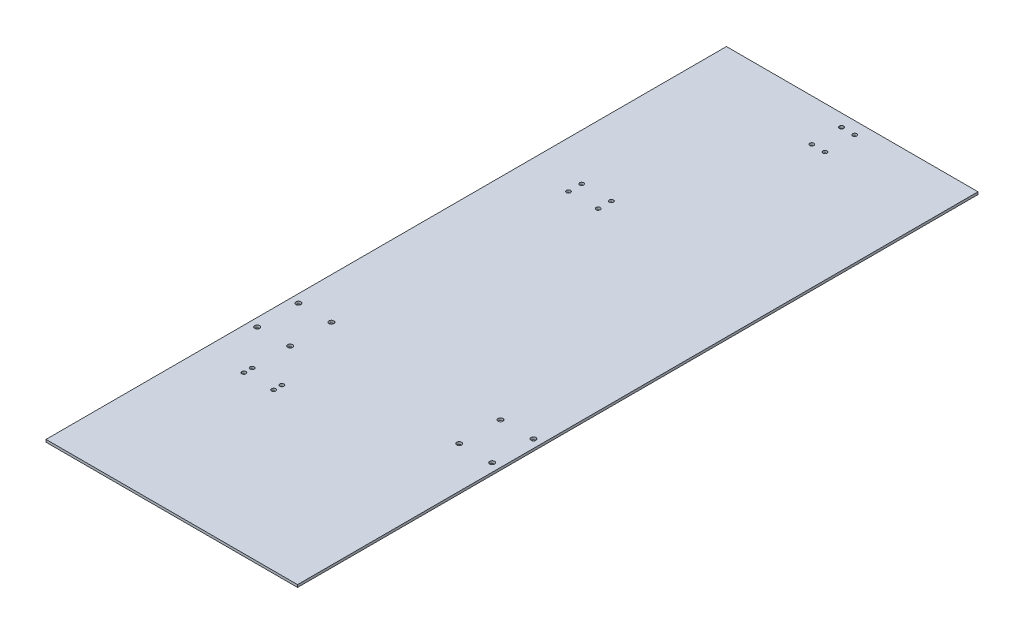
ISO-10303-21;
HEADER;
FILE_DESCRIPTION(('STEP AP214'),'2;1');
FILE_NAME('part.step','',(''),(''),'','','');
FILE_SCHEMA(('AUTOMOTIVE_DESIGN { 1 0 10303 214 1 1 1 1 }'));
ENDSEC;
DATA;
#1=APPLICATION_CONTEXT('core data for automotive mechanical design processes');
#2=APPLICATION_PROTOCOL_DEFINITION('international standard','automotive_design',2000,#1);
#3=PRODUCT_CONTEXT('',#1,'mechanical');
#4=PRODUCT('Part','Part','',(#3));
#5=PRODUCT_RELATED_PRODUCT_CATEGORY('part','',(#4));
#6=PRODUCT_DEFINITION_FORMATION('','',#4);
#7=PRODUCT_DEFINITION_CONTEXT('part definition',#1,'design');
#8=PRODUCT_DEFINITION('design','',#6,#7);
#9=PRODUCT_DEFINITION_SHAPE('','',#8);
#10=(LENGTH_UNIT() NAMED_UNIT(*) SI_UNIT(.MILLI.,.METRE.));
#11=(NAMED_UNIT(*) PLANE_ANGLE_UNIT() SI_UNIT($,.RADIAN.));
#12=(NAMED_UNIT(*) SI_UNIT($,.STERADIAN.) SOLID_ANGLE_UNIT());
#13=UNCERTAINTY_MEASURE_WITH_UNIT(LENGTH_MEASURE(1.E-05),#10,'distance_accuracy_value','');
#14=(GEOMETRIC_REPRESENTATION_CONTEXT(3) GLOBAL_UNCERTAINTY_ASSIGNED_CONTEXT((#13)) GLOBAL_UNIT_ASSIGNED_CONTEXT((#10,
#11,#12)) REPRESENTATION_CONTEXT('',''));
#15=CARTESIAN_POINT('',(0.,0.,0.));
#16=DIRECTION('',(0.,0.,1.));
#17=DIRECTION('',(1.,0.,0.));
#18=AXIS2_PLACEMENT_3D('',#15,#16,#17);
#19=CARTESIAN_POINT('',(0.,3.,0.));
#20=DIRECTION('',(0.,1.,0.));
#21=DIRECTION('',(0.,0.,1.));
#22=AXIS2_PLACEMENT_3D('',#19,#20,#21);
#23=PLANE('',#22);
#24=CARTESIAN_POINT('',(116.,3.,-95.9999999999999));
#25=DIRECTION('',(0.,1.,0.));
#26=DIRECTION('',(0.,0.,-1.));
#27=AXIS2_PLACEMENT_3D('',#24,#25,#26);
#28=CIRCLE('',#27,2.99999999999999);
#29=CARTESIAN_POINT('',(116.,3.,-98.9999999999999));
#30=VERTEX_POINT('',#29);
#31=EDGE_CURVE('E279',#30,#30,#28,.T.);
#32=ORIENTED_EDGE('',*,*,#31,.F.);
#33=EDGE_LOOP('',(#32));
#34=FACE_BOUND('',#33,.T.);
#35=CARTESIAN_POINT('',(-129.,3.,-146.));
#36=DIRECTION('',(0.,1.,0.));
#37=DIRECTION('',(0.,0.,-1.));
#38=AXIS2_PLACEMENT_3D('',#35,#36,#37);
#39=CIRCLE('',#38,2.99999999999999);
#40=CARTESIAN_POINT('',(-129.,3.,-149.));
#41=VERTEX_POINT('',#40);
#42=EDGE_CURVE('E283',#41,#41,#39,.T.);
#43=ORIENTED_EDGE('',*,*,#42,.F.);
#44=EDGE_LOOP('',(#43));
#45=FACE_BOUND('',#44,.T.);
#46=CARTESIAN_POINT('',(-129.,3.,-95.9999999999999));
#47=DIRECTION('',(0.,1.,0.));
#48=DIRECTION('',(0.,0.,-1.));
#49=AXIS2_PLACEMENT_3D('',#46,#47,#48);
#50=CIRCLE('',#49,2.99999999999999);
#51=CARTESIAN_POINT('',(-129.,3.,-98.9999999999999));
#52=VERTEX_POINT('',#51);
#53=EDGE_CURVE('E287',#52,#52,#50,.T.);
#54=ORIENTED_EDGE('',*,*,#53,.F.);
#55=EDGE_LOOP('',(#54));
#56=FACE_BOUND('',#55,.T.);
#57=CARTESIAN_POINT('',(-169.,3.,-146.));
#58=DIRECTION('',(0.,1.,0.));
#59=DIRECTION('',(0.,0.,1.));
#60=AXIS2_PLACEMENT_3D('',#57,#58,#59);
#61=CIRCLE('',#60,2.99999999999999);
#62=CARTESIAN_POINT('',(-169.,3.,-143.));
#63=VERTEX_POINT('',#62);
#64=EDGE_CURVE('E291',#63,#63,#61,.T.);
#65=ORIENTED_EDGE('',*,*,#64,.F.);
#66=EDGE_LOOP('',(#65));
#67=FACE_BOUND('',#66,.T.);
#68=CARTESIAN_POINT('',(76.,3.,-95.9999999999999));
#69=DIRECTION('',(0.,1.,0.));
#70=DIRECTION('',(0.,0.,1.));
#71=AXIS2_PLACEMENT_3D('',#68,#69,#70);
#72=CIRCLE('',#71,2.99999999999999);
#73=CARTESIAN_POINT('',(76.,3.,-93.));
#74=VERTEX_POINT('',#73);
#75=EDGE_CURVE('E295',#74,#74,#72,.T.);
#76=ORIENTED_EDGE('',*,*,#75,.F.);
#77=EDGE_LOOP('',(#76));
#78=FACE_BOUND('',#77,.T.);
#79=CARTESIAN_POINT('',(76.,3.,-146.));
#80=DIRECTION('',(0.,1.,0.));
#81=DIRECTION('',(0.,0.,1.));
#82=AXIS2_PLACEMENT_3D('',#79,#80,#81);
#83=CIRCLE('',#82,2.99999999999999);
#84=CARTESIAN_POINT('',(76.,3.,-143.));
#85=VERTEX_POINT('',#84);
#86=EDGE_CURVE('E299',#85,#85,#83,.T.);
#87=ORIENTED_EDGE('',*,*,#86,.F.);
#88=EDGE_LOOP('',(#87));
#89=FACE_BOUND('',#88,.T.);
#90=CARTESIAN_POINT('',(116.,3.,-146.));
#91=DIRECTION('',(0.,1.,0.));
#92=DIRECTION('',(0.,0.,-1.));
#93=AXIS2_PLACEMENT_3D('',#90,#91,#92);
#94=CIRCLE('',#93,2.99999999999999);
#95=CARTESIAN_POINT('',(116.,3.,-149.));
#96=VERTEX_POINT('',#95);
#97=EDGE_CURVE('E303',#96,#96,#94,.T.);
#98=ORIENTED_EDGE('',*,*,#97,.F.);
#99=EDGE_LOOP('',(#98));
#100=FACE_BOUND('',#99,.T.);
#101=CARTESIAN_POINT('',(-169.,3.,-95.9999999999999));
#102=DIRECTION('',(0.,1.,0.));
#103=DIRECTION('',(0.,0.,1.));
#104=AXIS2_PLACEMENT_3D('',#101,#102,#103);
#105=CIRCLE('',#104,2.99999999999999);
#106=CARTESIAN_POINT('',(-169.,3.,-93.));
#107=VERTEX_POINT('',#106);
#108=EDGE_CURVE('E114',#107,#107,#105,.T.);
#109=ORIENTED_EDGE('',*,*,#108,.F.);
#110=EDGE_LOOP('',(#109));
#111=FACE_BOUND('',#110,.T.);
#112=CARTESIAN_POINT('',(-122.5,3.,-443.));
#113=DIRECTION('',(0.,1.,0.));
#114=DIRECTION('',(0.,0.,1.));
#115=AXIS2_PLACEMENT_3D('',#112,#113,#114);
#116=CIRCLE('',#115,2.50000000000001);
#117=CARTESIAN_POINT('',(-122.5,3.,-440.5));
#118=VERTEX_POINT('',#117);
#119=EDGE_CURVE('E130',#118,#118,#116,.F.);
#120=ORIENTED_EDGE('',*,*,#119,.T.);
#121=EDGE_LOOP('',(#120));
#122=FACE_BOUND('',#121,.T.);
#123=CARTESIAN_POINT('',(-86.5,3.,-443.));
#124=DIRECTION('',(0.,1.,0.));
#125=DIRECTION('',(0.,0.,1.));
#126=AXIS2_PLACEMENT_3D('',#123,#124,#125);
#127=CIRCLE('',#126,2.5);
#128=CARTESIAN_POINT('',(-86.5,3.,-440.5));
#129=VERTEX_POINT('',#128);
#130=EDGE_CURVE('E137',#129,#129,#127,.F.);
#131=ORIENTED_EDGE('',*,*,#130,.T.);
#132=EDGE_LOOP('',(#131));
#133=FACE_BOUND('',#132,.T.);
#134=DIRECTION('',(1.,0.,0.));
#135=VECTOR('',#134,1.);
#136=CARTESIAN_POINT('',(-171.,3.,-675.));
#137=LINE('',#136,#135);
#138=CARTESIAN_POINT('',(-179.,3.,-675.));
#139=VERTEX_POINT('',#138);
#140=CARTESIAN_POINT('',(126.,3.,-675.));
#141=VERTEX_POINT('',#140);
#142=EDGE_CURVE('E73',#139,#141,#137,.T.);
#143=ORIENTED_EDGE('',*,*,#142,.F.);
#144=DIRECTION('',(0.,0.,1.));
#145=VECTOR('',#144,1.);
#146=CARTESIAN_POINT('',(-179.,3.,150.));
#147=LINE('',#146,#145);
#148=CARTESIAN_POINT('',(-179.,3.,150.));
#149=VERTEX_POINT('',#148);
#150=EDGE_CURVE('E102',#139,#149,#147,.T.);
#151=ORIENTED_EDGE('',*,*,#150,.T.);
#152=DIRECTION('',(1.,0.,0.));
#153=VECTOR('',#152,1.);
#154=CARTESIAN_POINT('',(-171.,3.,150.));
#155=LINE('',#154,#153);
#156=CARTESIAN_POINT('',(126.,3.,150.));
#157=VERTEX_POINT('',#156);
#158=EDGE_CURVE('E52',#149,#157,#155,.T.);
#159=ORIENTED_EDGE('',*,*,#158,.T.);
#160=DIRECTION('',(0.,0.,-1.));
#161=VECTOR('',#160,1.);
#162=CARTESIAN_POINT('',(126.,3.,150.));
#163=LINE('',#162,#161);
#164=EDGE_CURVE('E99',#157,#141,#163,.T.);
#165=ORIENTED_EDGE('',*,*,#164,.T.);
#166=EDGE_LOOP('',(#143,#151,#159,#165));
#167=FACE_BOUND('',#166,.T.);
#168=CARTESIAN_POINT('',(-24.5,3.,-660.));
#169=DIRECTION('',(0.,1.,0.));
#170=DIRECTION('',(0.,0.,-1.));
#171=AXIS2_PLACEMENT_3D('',#168,#169,#170);
#172=CIRCLE('',#171,2.5);
#173=CARTESIAN_POINT('',(-24.5,3.,-662.5));
#174=VERTEX_POINT('',#173);
#175=EDGE_CURVE('E93',#174,#174,#172,.T.);
#176=ORIENTED_EDGE('',*,*,#175,.F.);
#177=EDGE_LOOP('',(#176));
#178=FACE_BOUND('',#177,.T.);
#179=CARTESIAN_POINT('',(-24.5,3.,-624.));
#180=DIRECTION('',(0.,1.,0.));
#181=DIRECTION('',(0.,0.,-1.));
#182=AXIS2_PLACEMENT_3D('',#179,#180,#181);
#183=CIRCLE('',#182,2.5);
#184=CARTESIAN_POINT('',(-24.5,3.,-626.5));
#185=VERTEX_POINT('',#184);
#186=EDGE_CURVE('E154',#185,#185,#183,.T.);
#187=ORIENTED_EDGE('',*,*,#186,.F.);
#188=EDGE_LOOP('',(#187));
#189=FACE_BOUND('',#188,.T.);
#190=CARTESIAN_POINT('',(-8.49999999999998,3.,-624.));
#191=DIRECTION('',(0.,1.,0.));
#192=DIRECTION('',(0.,0.,1.));
#193=AXIS2_PLACEMENT_3D('',#190,#191,#192);
#194=CIRCLE('',#193,2.5);
#195=CARTESIAN_POINT('',(-8.49999999999998,3.,-621.5));
#196=VERTEX_POINT('',#195);
#197=EDGE_CURVE('E149',#196,#196,#194,.T.);
#198=ORIENTED_EDGE('',*,*,#197,.F.);
#199=EDGE_LOOP('',(#198));
#200=FACE_BOUND('',#199,.T.);
#201=CARTESIAN_POINT('',(-8.49999999999998,3.,-660.));
#202=DIRECTION('',(0.,1.,0.));
#203=DIRECTION('',(0.,0.,1.));
#204=AXIS2_PLACEMENT_3D('',#201,#202,#203);
#205=CIRCLE('',#204,2.5);
#206=CARTESIAN_POINT('',(-8.49999999999998,3.,-657.5));
#207=VERTEX_POINT('',#206);
#208=EDGE_CURVE('E153',#207,#207,#205,.T.);
#209=ORIENTED_EDGE('',*,*,#208,.F.);
#210=EDGE_LOOP('',(#209));
#211=FACE_BOUND('',#210,.T.);
#212=CARTESIAN_POINT('',(-93.,3.,-49.9999999999999));
#213=DIRECTION('',(0.,1.,0.));
#214=DIRECTION('',(0.,0.,-1.));
#215=AXIS2_PLACEMENT_3D('',#212,#213,#214);
#216=CIRCLE('',#215,2.5);
#217=CARTESIAN_POINT('',(-93.,3.,-52.4999999999999));
#218=VERTEX_POINT('',#217);
#219=EDGE_CURVE('E174',#218,#218,#216,.T.);
#220=ORIENTED_EDGE('',*,*,#219,.F.);
#221=EDGE_LOOP('',(#220));
#222=FACE_BOUND('',#221,.T.);
#223=CARTESIAN_POINT('',(-93.,3.,-39.9999999999999));
#224=DIRECTION('',(0.,1.,0.));
#225=DIRECTION('',(0.,0.,-1.));
#226=AXIS2_PLACEMENT_3D('',#223,#224,#225);
#227=CIRCLE('',#226,2.5);
#228=CARTESIAN_POINT('',(-93.,3.,-42.4999999999999));
#229=VERTEX_POINT('',#228);
#230=EDGE_CURVE('E170',#229,#229,#227,.T.);
#231=ORIENTED_EDGE('',*,*,#230,.F.);
#232=EDGE_LOOP('',(#231));
#233=FACE_BOUND('',#232,.T.);
#234=CARTESIAN_POINT('',(-129.,3.,-39.9999999999999));
#235=DIRECTION('',(0.,1.,0.));
#236=DIRECTION('',(0.,0.,1.));
#237=AXIS2_PLACEMENT_3D('',#234,#235,#236);
#238=CIRCLE('',#237,2.5);
#239=CARTESIAN_POINT('',(-129.,3.,-37.4999999999999));
#240=VERTEX_POINT('',#239);
#241=EDGE_CURVE('E165',#240,#240,#238,.T.);
#242=ORIENTED_EDGE('',*,*,#241,.F.);
#243=EDGE_LOOP('',(#242));
#244=FACE_BOUND('',#243,.T.);
#245=CARTESIAN_POINT('',(-129.,3.,-49.9999999999999));
#246=DIRECTION('',(0.,1.,0.));
#247=DIRECTION('',(0.,0.,1.));
#248=AXIS2_PLACEMENT_3D('',#245,#246,#247);
#249=CIRCLE('',#248,2.5);
#250=CARTESIAN_POINT('',(-129.,3.,-47.4999999999999));
#251=VERTEX_POINT('',#250);
#252=EDGE_CURVE('E169',#251,#251,#249,.T.);
#253=ORIENTED_EDGE('',*,*,#252,.F.);
#254=EDGE_LOOP('',(#253));
#255=FACE_BOUND('',#254,.T.);
#256=CARTESIAN_POINT('',(-86.5,3.,-427.));
#257=DIRECTION('',(0.,1.,0.));
#258=DIRECTION('',(0.,0.,1.));
#259=AXIS2_PLACEMENT_3D('',#256,#257,#258);
#260=CIRCLE('',#259,2.5);
#261=CARTESIAN_POINT('',(-86.5,3.,-424.5));
#262=VERTEX_POINT('',#261);
#263=EDGE_CURVE('E133',#262,#262,#260,.T.);
#264=ORIENTED_EDGE('',*,*,#263,.F.);
#265=EDGE_LOOP('',(#264));
#266=FACE_BOUND('',#265,.T.);
#267=CARTESIAN_POINT('',(-122.5,3.,-427.));
#268=DIRECTION('',(0.,1.,0.));
#269=DIRECTION('',(0.,0.,1.));
#270=AXIS2_PLACEMENT_3D('',#267,#268,#269);
#271=CIRCLE('',#270,2.50000000000001);
#272=CARTESIAN_POINT('',(-122.5,3.,-424.5));
#273=VERTEX_POINT('',#272);
#274=EDGE_CURVE('E138',#273,#273,#271,.T.);
#275=ORIENTED_EDGE('',*,*,#274,.F.);
#276=EDGE_LOOP('',(#275));
#277=FACE_BOUND('',#276,.T.);
#278=ADVANCED_FACE('F41',(#34,#45,#56,#67,#78,#89,#100,#111,#122,#133,#167,#178,#189,#200,#211,
#222,#233,#244,#255,#266,#277),#23,.T.);
#279=CARTESIAN_POINT('',(0.,0.,0.));
#280=DIRECTION('',(0.,1.,0.));
#281=DIRECTION('',(0.,0.,1.));
#282=AXIS2_PLACEMENT_3D('',#279,#280,#281);
#283=PLANE('',#282);
#284=CARTESIAN_POINT('',(116.,0.,-95.9999999999999));
#285=DIRECTION('',(0.,1.,0.));
#286=DIRECTION('',(0.,0.,-1.));
#287=AXIS2_PLACEMENT_3D('',#284,#285,#286);
#288=CIRCLE('',#287,2.99999999999999);
#289=CARTESIAN_POINT('',(116.,0.,-98.9999999999999));
#290=VERTEX_POINT('',#289);
#291=EDGE_CURVE('E437',#290,#290,#288,.T.);
#292=ORIENTED_EDGE('',*,*,#291,.T.);
#293=EDGE_LOOP('',(#292));
#294=FACE_BOUND('',#293,.T.);
#295=CARTESIAN_POINT('',(-129.,0.,-146.));
#296=DIRECTION('',(0.,1.,0.));
#297=DIRECTION('',(0.,0.,-1.));
#298=AXIS2_PLACEMENT_3D('',#295,#296,#297);
#299=CIRCLE('',#298,2.99999999999999);
#300=CARTESIAN_POINT('',(-129.,0.,-149.));
#301=VERTEX_POINT('',#300);
#302=EDGE_CURVE('E431',#301,#301,#299,.T.);
#303=ORIENTED_EDGE('',*,*,#302,.T.);
#304=EDGE_LOOP('',(#303));
#305=FACE_BOUND('',#304,.T.);
#306=CARTESIAN_POINT('',(-129.,0.,-95.9999999999999));
#307=DIRECTION('',(0.,1.,0.));
#308=DIRECTION('',(0.,0.,-1.));
#309=AXIS2_PLACEMENT_3D('',#306,#307,#308);
#310=CIRCLE('',#309,2.99999999999999);
#311=CARTESIAN_POINT('',(-129.,0.,-98.9999999999999));
#312=VERTEX_POINT('',#311);
#313=EDGE_CURVE('E449',#312,#312,#310,.T.);
#314=ORIENTED_EDGE('',*,*,#313,.T.);
#315=EDGE_LOOP('',(#314));
#316=FACE_BOUND('',#315,.T.);
#317=CARTESIAN_POINT('',(-169.,0.,-146.));
#318=DIRECTION('',(0.,1.,0.));
#319=DIRECTION('',(0.,0.,1.));
#320=AXIS2_PLACEMENT_3D('',#317,#318,#319);
#321=CIRCLE('',#320,2.99999999999999);
#322=CARTESIAN_POINT('',(-169.,0.,-143.));
#323=VERTEX_POINT('',#322);
#324=EDGE_CURVE('E443',#323,#323,#321,.T.);
#325=ORIENTED_EDGE('',*,*,#324,.T.);
#326=EDGE_LOOP('',(#325));
#327=FACE_BOUND('',#326,.T.);
#328=CARTESIAN_POINT('',(76.,0.,-95.9999999999999));
#329=DIRECTION('',(0.,1.,0.));
#330=DIRECTION('',(0.,0.,1.));
#331=AXIS2_PLACEMENT_3D('',#328,#329,#330);
#332=CIRCLE('',#331,2.99999999999999);
#333=CARTESIAN_POINT('',(76.,0.,-93.));
#334=VERTEX_POINT('',#333);
#335=EDGE_CURVE('E413',#334,#334,#332,.T.);
#336=ORIENTED_EDGE('',*,*,#335,.T.);
#337=EDGE_LOOP('',(#336));
#338=FACE_BOUND('',#337,.T.);
#339=CARTESIAN_POINT('',(76.,0.,-146.));
#340=DIRECTION('',(0.,1.,0.));
#341=DIRECTION('',(0.,0.,1.));
#342=AXIS2_PLACEMENT_3D('',#339,#340,#341);
#343=CIRCLE('',#342,2.99999999999999);
#344=CARTESIAN_POINT('',(76.,0.,-143.));
#345=VERTEX_POINT('',#344);
#346=EDGE_CURVE('E415',#345,#345,#343,.T.);
#347=ORIENTED_EDGE('',*,*,#346,.T.);
#348=EDGE_LOOP('',(#347));
#349=FACE_BOUND('',#348,.T.);
#350=CARTESIAN_POINT('',(116.,0.,-146.));
#351=DIRECTION('',(0.,1.,0.));
#352=DIRECTION('',(0.,0.,-1.));
#353=AXIS2_PLACEMENT_3D('',#350,#351,#352);
#354=CIRCLE('',#353,2.99999999999999);
#355=CARTESIAN_POINT('',(116.,0.,-149.));
#356=VERTEX_POINT('',#355);
#357=EDGE_CURVE('E425',#356,#356,#354,.T.);
#358=ORIENTED_EDGE('',*,*,#357,.T.);
#359=EDGE_LOOP('',(#358));
#360=FACE_BOUND('',#359,.T.);
#361=CARTESIAN_POINT('',(-169.,0.,-95.9999999999999));
#362=DIRECTION('',(0.,1.,0.));
#363=DIRECTION('',(0.,0.,1.));
#364=AXIS2_PLACEMENT_3D('',#361,#362,#363);
#365=CIRCLE('',#364,2.99999999999999);
#366=CARTESIAN_POINT('',(-169.,0.,-93.));
#367=VERTEX_POINT('',#366);
#368=EDGE_CURVE('E108',#367,#367,#365,.T.);
#369=ORIENTED_EDGE('',*,*,#368,.T.);
#370=EDGE_LOOP('',(#369));
#371=FACE_BOUND('',#370,.T.);
#372=CARTESIAN_POINT('',(-122.5,0.,-443.));
#373=DIRECTION('',(0.,1.,0.));
#374=DIRECTION('',(0.,0.,1.));
#375=AXIS2_PLACEMENT_3D('',#372,#373,#374);
#376=CIRCLE('',#375,2.50000000000001);
#377=CARTESIAN_POINT('',(-122.5,0.,-440.5));
#378=VERTEX_POINT('',#377);
#379=EDGE_CURVE('E45',#378,#378,#376,.F.);
#380=ORIENTED_EDGE('',*,*,#379,.F.);
#381=EDGE_LOOP('',(#380));
#382=FACE_BOUND('',#381,.T.);
#383=CARTESIAN_POINT('',(-86.5,0.,-427.));
#384=DIRECTION('',(0.,1.,0.));
#385=DIRECTION('',(0.,0.,1.));
#386=AXIS2_PLACEMENT_3D('',#383,#384,#385);
#387=CIRCLE('',#386,2.5);
#388=CARTESIAN_POINT('',(-86.5,0.,-424.5));
#389=VERTEX_POINT('',#388);
#390=EDGE_CURVE('E219',#389,#389,#387,.T.);
#391=ORIENTED_EDGE('',*,*,#390,.T.);
#392=EDGE_LOOP('',(#391));
#393=FACE_BOUND('',#392,.T.);
#394=CARTESIAN_POINT('',(-86.5,0.,-443.));
#395=DIRECTION('',(0.,1.,0.));
#396=DIRECTION('',(0.,0.,1.));
#397=AXIS2_PLACEMENT_3D('',#394,#395,#396);
#398=CIRCLE('',#397,2.5);
#399=CARTESIAN_POINT('',(-86.5,0.,-440.5));
#400=VERTEX_POINT('',#399);
#401=EDGE_CURVE('E147',#400,#400,#398,.F.);
#402=ORIENTED_EDGE('',*,*,#401,.F.);
#403=EDGE_LOOP('',(#402));
#404=FACE_BOUND('',#403,.T.);
#405=CARTESIAN_POINT('',(-24.5,0.,-660.));
#406=DIRECTION('',(0.,1.,0.));
#407=DIRECTION('',(0.,0.,1.));
#408=AXIS2_PLACEMENT_3D('',#405,#406,#407);
#409=CIRCLE('',#408,2.5);
#410=CARTESIAN_POINT('',(-24.5,0.,-657.5));
#411=VERTEX_POINT('',#410);
#412=EDGE_CURVE('E178',#411,#411,#409,.T.);
#413=ORIENTED_EDGE('',*,*,#412,.T.);
#414=EDGE_LOOP('',(#413));
#415=FACE_BOUND('',#414,.T.);
#416=CARTESIAN_POINT('',(-24.5,0.,-624.));
#417=DIRECTION('',(0.,1.,0.));
#418=DIRECTION('',(0.,0.,1.));
#419=AXIS2_PLACEMENT_3D('',#416,#417,#418);
#420=CIRCLE('',#419,2.5);
#421=CARTESIAN_POINT('',(-24.5,0.,-621.5));
#422=VERTEX_POINT('',#421);
#423=EDGE_CURVE('E209',#422,#422,#420,.T.);
#424=ORIENTED_EDGE('',*,*,#423,.T.);
#425=EDGE_LOOP('',(#424));
#426=FACE_BOUND('',#425,.T.);
#427=CARTESIAN_POINT('',(-8.49999999999998,0.,-624.));
#428=DIRECTION('',(0.,1.,0.));
#429=DIRECTION('',(0.,0.,1.));
#430=AXIS2_PLACEMENT_3D('',#427,#428,#429);
#431=CIRCLE('',#430,2.5);
#432=CARTESIAN_POINT('',(-8.49999999999998,0.,-621.5));
#433=VERTEX_POINT('',#432);
#434=EDGE_CURVE('E205',#433,#433,#431,.T.);
#435=ORIENTED_EDGE('',*,*,#434,.T.);
#436=EDGE_LOOP('',(#435));
#437=FACE_BOUND('',#436,.T.);
#438=CARTESIAN_POINT('',(-8.49999999999998,0.,-660.));
#439=DIRECTION('',(0.,1.,0.));
#440=DIRECTION('',(0.,0.,1.));
#441=AXIS2_PLACEMENT_3D('',#438,#439,#440);
#442=CIRCLE('',#441,2.5);
#443=CARTESIAN_POINT('',(-8.49999999999998,0.,-657.5));
#444=VERTEX_POINT('',#443);
#445=EDGE_CURVE('E164',#444,#444,#442,.T.);
#446=ORIENTED_EDGE('',*,*,#445,.T.);
#447=EDGE_LOOP('',(#446));
#448=FACE_BOUND('',#447,.T.);
#449=CARTESIAN_POINT('',(-93.,0.,-49.9999999999999));
#450=DIRECTION('',(0.,1.,0.));
#451=DIRECTION('',(0.,0.,1.));
#452=AXIS2_PLACEMENT_3D('',#449,#450,#451);
#453=CIRCLE('',#452,2.5);
#454=CARTESIAN_POINT('',(-93.,0.,-47.4999999999999));
#455=VERTEX_POINT('',#454);
#456=EDGE_CURVE('E187',#455,#455,#453,.T.);
#457=ORIENTED_EDGE('',*,*,#456,.T.);
#458=EDGE_LOOP('',(#457));
#459=FACE_BOUND('',#458,.T.);
#460=CARTESIAN_POINT('',(-93.,0.,-39.9999999999999));
#461=DIRECTION('',(0.,1.,0.));
#462=DIRECTION('',(0.,0.,1.));
#463=AXIS2_PLACEMENT_3D('',#460,#461,#462);
#464=CIRCLE('',#463,2.5);
#465=CARTESIAN_POINT('',(-93.,0.,-37.4999999999999));
#466=VERTEX_POINT('',#465);
#467=EDGE_CURVE('E195',#466,#466,#464,.T.);
#468=ORIENTED_EDGE('',*,*,#467,.T.);
#469=EDGE_LOOP('',(#468));
#470=FACE_BOUND('',#469,.T.);
#471=CARTESIAN_POINT('',(-129.,0.,-39.9999999999999));
#472=DIRECTION('',(0.,1.,0.));
#473=DIRECTION('',(0.,0.,1.));
#474=AXIS2_PLACEMENT_3D('',#471,#472,#473);
#475=CIRCLE('',#474,2.5);
#476=CARTESIAN_POINT('',(-129.,0.,-37.4999999999999));
#477=VERTEX_POINT('',#476);
#478=EDGE_CURVE('E191',#477,#477,#475,.T.);
#479=ORIENTED_EDGE('',*,*,#478,.T.);
#480=EDGE_LOOP('',(#479));
#481=FACE_BOUND('',#480,.T.);
#482=CARTESIAN_POINT('',(-129.,0.,-49.9999999999999));
#483=DIRECTION('',(0.,1.,0.));
#484=DIRECTION('',(0.,0.,1.));
#485=AXIS2_PLACEMENT_3D('',#482,#483,#484);
#486=CIRCLE('',#485,2.5);
#487=CARTESIAN_POINT('',(-129.,0.,-47.4999999999999));
#488=VERTEX_POINT('',#487);
#489=EDGE_CURVE('E182',#488,#488,#486,.T.);
#490=ORIENTED_EDGE('',*,*,#489,.T.);
#491=EDGE_LOOP('',(#490));
#492=FACE_BOUND('',#491,.T.);
#493=DIRECTION('',(1.,0.,0.));
#494=VECTOR('',#493,1.);
#495=CARTESIAN_POINT('',(-118.,0.,150.));
#496=LINE('',#495,#494);
#497=CARTESIAN_POINT('',(-179.,0.,150.));
#498=VERTEX_POINT('',#497);
#499=CARTESIAN_POINT('',(126.,0.,150.));
#500=VERTEX_POINT('',#499);
#501=EDGE_CURVE('E61',#498,#500,#496,.T.);
#502=ORIENTED_EDGE('',*,*,#501,.F.);
#503=DIRECTION('',(0.,0.,1.));
#504=VECTOR('',#503,1.);
#505=CARTESIAN_POINT('',(-179.,0.,150.));
#506=LINE('',#505,#504);
#507=CARTESIAN_POINT('',(-179.,0.,-675.));
#508=VERTEX_POINT('',#507);
#509=EDGE_CURVE('E120',#508,#498,#506,.T.);
#510=ORIENTED_EDGE('',*,*,#509,.F.);
#511=DIRECTION('',(1.,0.,0.));
#512=VECTOR('',#511,1.);
#513=CARTESIAN_POINT('',(0.,0.,-675.));
#514=LINE('',#513,#512);
#515=CARTESIAN_POINT('',(126.,0.,-675.));
#516=VERTEX_POINT('',#515);
#517=EDGE_CURVE('E11',#508,#516,#514,.T.);
#518=ORIENTED_EDGE('',*,*,#517,.T.);
#519=DIRECTION('',(0.,0.,-1.));
#520=VECTOR('',#519,1.);
#521=CARTESIAN_POINT('',(126.,0.,150.));
#522=LINE('',#521,#520);
#523=EDGE_CURVE('E100',#500,#516,#522,.T.);
#524=ORIENTED_EDGE('',*,*,#523,.F.);
#525=EDGE_LOOP('',(#502,#510,#518,#524));
#526=FACE_BOUND('',#525,.T.);
#527=CARTESIAN_POINT('',(-122.5,0.,-427.));
#528=DIRECTION('',(0.,1.,0.));
#529=DIRECTION('',(0.,0.,1.));
#530=AXIS2_PLACEMENT_3D('',#527,#528,#529);
#531=CIRCLE('',#530,2.50000000000001);
#532=CARTESIAN_POINT('',(-122.5,0.,-424.5));
#533=VERTEX_POINT('',#532);
#534=EDGE_CURVE('E222',#533,#533,#531,.T.);
#535=ORIENTED_EDGE('',*,*,#534,.T.);
#536=EDGE_LOOP('',(#535));
#537=FACE_BOUND('',#536,.T.);
#538=ADVANCED_FACE('F233',(#294,#305,#316,#327,#338,#349,#360,#371,#382,#393,#404,#415,#426,
#437,#448,#459,#470,#481,#492,#526,#537),#283,.F.);
#539=CARTESIAN_POINT('',(-118.,3.,150.));
#540=DIRECTION('',(0.,0.,-1.));
#541=DIRECTION('',(-1.,0.,0.));
#542=AXIS2_PLACEMENT_3D('',#539,#540,#541);
#543=PLANE('',#542);
#544=ORIENTED_EDGE('',*,*,#501,.T.);
#545=DIRECTION('',(0.,1.,0.));
#546=VECTOR('',#545,1.);
#547=CARTESIAN_POINT('',(126.,0.,150.));
#548=LINE('',#547,#546);
#549=EDGE_CURVE('E103',#500,#157,#548,.T.);
#550=ORIENTED_EDGE('',*,*,#549,.T.);
#551=ORIENTED_EDGE('',*,*,#158,.F.);
#552=DIRECTION('',(0.,1.,0.));
#553=VECTOR('',#552,1.);
#554=CARTESIAN_POINT('',(-179.,0.,150.));
#555=LINE('',#554,#553);
#556=EDGE_CURVE('E126',#498,#149,#555,.T.);
#557=ORIENTED_EDGE('',*,*,#556,.F.);
#558=EDGE_LOOP('',(#544,#550,#551,#557));
#559=FACE_BOUND('',#558,.T.);
#560=ADVANCED_FACE('F43',(#559),#543,.F.);
#561=CARTESIAN_POINT('',(-129.,-17.,-49.9999999999999));
#562=DIRECTION('',(0.,1.,0.));
#563=DIRECTION('',(0.,0.,1.));
#564=AXIS2_PLACEMENT_3D('',#561,#562,#563);
#565=CYLINDRICAL_SURFACE('',#564,2.5);
#566=ORIENTED_EDGE('',*,*,#252,.T.);
#567=EDGE_LOOP('',(#566));
#568=FACE_BOUND('',#567,.T.);
#569=ORIENTED_EDGE('',*,*,#489,.F.);
#570=EDGE_LOOP('',(#569));
#571=FACE_BOUND('',#570,.T.);
#572=ADVANCED_FACE('F257',(#568,#571),#565,.F.);
#573=CARTESIAN_POINT('',(-129.,-17.,-39.9999999999999));
#574=DIRECTION('',(0.,1.,0.));
#575=DIRECTION('',(0.,0.,1.));
#576=AXIS2_PLACEMENT_3D('',#573,#574,#575);
#577=CYLINDRICAL_SURFACE('',#576,2.5);
#578=ORIENTED_EDGE('',*,*,#241,.T.);
#579=EDGE_LOOP('',(#578));
#580=FACE_BOUND('',#579,.T.);
#581=ORIENTED_EDGE('',*,*,#478,.F.);
#582=EDGE_LOOP('',(#581));
#583=FACE_BOUND('',#582,.T.);
#584=ADVANCED_FACE('F259',(#580,#583),#577,.F.);
#585=CARTESIAN_POINT('',(-93.,-17.,-39.9999999999999));
#586=DIRECTION('',(0.,1.,0.));
#587=DIRECTION('',(0.,0.,1.));
#588=AXIS2_PLACEMENT_3D('',#585,#586,#587);
#589=CYLINDRICAL_SURFACE('',#588,2.5);
#590=ORIENTED_EDGE('',*,*,#230,.T.);
#591=EDGE_LOOP('',(#590));
#592=FACE_BOUND('',#591,.T.);
#593=ORIENTED_EDGE('',*,*,#467,.F.);
#594=EDGE_LOOP('',(#593));
#595=FACE_BOUND('',#594,.T.);
#596=ADVANCED_FACE('F266',(#592,#595),#589,.F.);
#597=CARTESIAN_POINT('',(-93.,-17.,-49.9999999999999));
#598=DIRECTION('',(0.,1.,0.));
#599=DIRECTION('',(0.,0.,1.));
#600=AXIS2_PLACEMENT_3D('',#597,#598,#599);
#601=CYLINDRICAL_SURFACE('',#600,2.5);
#602=ORIENTED_EDGE('',*,*,#219,.T.);
#603=EDGE_LOOP('',(#602));
#604=FACE_BOUND('',#603,.T.);
#605=ORIENTED_EDGE('',*,*,#456,.F.);
#606=EDGE_LOOP('',(#605));
#607=FACE_BOUND('',#606,.T.);
#608=ADVANCED_FACE('F341',(#604,#607),#601,.F.);
#609=CARTESIAN_POINT('',(-8.49999999999998,-7.,-660.));
#610=DIRECTION('',(0.,1.,0.));
#611=DIRECTION('',(0.,0.,1.));
#612=AXIS2_PLACEMENT_3D('',#609,#610,#611);
#613=CYLINDRICAL_SURFACE('',#612,2.5);
#614=ORIENTED_EDGE('',*,*,#208,.T.);
#615=EDGE_LOOP('',(#614));
#616=FACE_BOUND('',#615,.T.);
#617=ORIENTED_EDGE('',*,*,#445,.F.);
#618=EDGE_LOOP('',(#617));
#619=FACE_BOUND('',#618,.T.);
#620=ADVANCED_FACE('F332',(#616,#619),#613,.F.);
#621=CARTESIAN_POINT('',(-8.49999999999998,-7.,-624.));
#622=DIRECTION('',(0.,1.,0.));
#623=DIRECTION('',(0.,0.,1.));
#624=AXIS2_PLACEMENT_3D('',#621,#622,#623);
#625=CYLINDRICAL_SURFACE('',#624,2.5);
#626=ORIENTED_EDGE('',*,*,#197,.T.);
#627=EDGE_LOOP('',(#626));
#628=FACE_BOUND('',#627,.T.);
#629=ORIENTED_EDGE('',*,*,#434,.F.);
#630=EDGE_LOOP('',(#629));
#631=FACE_BOUND('',#630,.T.);
#632=ADVANCED_FACE('F328',(#628,#631),#625,.F.);
#633=CARTESIAN_POINT('',(-24.5,-7.,-624.));
#634=DIRECTION('',(0.,1.,0.));
#635=DIRECTION('',(0.,0.,1.));
#636=AXIS2_PLACEMENT_3D('',#633,#634,#635);
#637=CYLINDRICAL_SURFACE('',#636,2.5);
#638=ORIENTED_EDGE('',*,*,#186,.T.);
#639=EDGE_LOOP('',(#638));
#640=FACE_BOUND('',#639,.T.);
#641=ORIENTED_EDGE('',*,*,#423,.F.);
#642=EDGE_LOOP('',(#641));
#643=FACE_BOUND('',#642,.T.);
#644=ADVANCED_FACE('F331',(#640,#643),#637,.F.);
#645=CARTESIAN_POINT('',(-24.5,-7.,-660.));
#646=DIRECTION('',(0.,1.,0.));
#647=DIRECTION('',(0.,0.,1.));
#648=AXIS2_PLACEMENT_3D('',#645,#646,#647);
#649=CYLINDRICAL_SURFACE('',#648,2.5);
#650=ORIENTED_EDGE('',*,*,#175,.T.);
#651=EDGE_LOOP('',(#650));
#652=FACE_BOUND('',#651,.T.);
#653=ORIENTED_EDGE('',*,*,#412,.F.);
#654=EDGE_LOOP('',(#653));
#655=FACE_BOUND('',#654,.T.);
#656=ADVANCED_FACE('F323',(#652,#655),#649,.F.);
#657=CARTESIAN_POINT('',(-171.,-7.,-675.));
#658=DIRECTION('',(0.,0.,1.));
#659=DIRECTION('',(1.,0.,0.));
#660=AXIS2_PLACEMENT_3D('',#657,#658,#659);
#661=PLANE('',#660);
#662=ORIENTED_EDGE('',*,*,#517,.F.);
#663=DIRECTION('',(0.,1.,0.));
#664=VECTOR('',#663,1.);
#665=CARTESIAN_POINT('',(-179.,0.,-675.));
#666=LINE('',#665,#664);
#667=EDGE_CURVE('E90',#508,#139,#666,.T.);
#668=ORIENTED_EDGE('',*,*,#667,.T.);
#669=ORIENTED_EDGE('',*,*,#142,.T.);
#670=DIRECTION('',(0.,1.,0.));
#671=VECTOR('',#670,1.);
#672=CARTESIAN_POINT('',(126.,0.,-675.));
#673=LINE('',#672,#671);
#674=EDGE_CURVE('E87',#516,#141,#673,.T.);
#675=ORIENTED_EDGE('',*,*,#674,.F.);
#676=EDGE_LOOP('',(#662,#668,#669,#675));
#677=FACE_BOUND('',#676,.T.);
#678=ADVANCED_FACE('F86',(#677),#661,.F.);
#679=CARTESIAN_POINT('',(-86.5,-2.,-443.));
#680=DIRECTION('',(0.,1.,0.));
#681=DIRECTION('',(0.,0.,1.));
#682=AXIS2_PLACEMENT_3D('',#679,#680,#681);
#683=CYLINDRICAL_SURFACE('',#682,2.5);
#684=ORIENTED_EDGE('',*,*,#130,.F.);
#685=EDGE_LOOP('',(#684));
#686=FACE_BOUND('',#685,.T.);
#687=ORIENTED_EDGE('',*,*,#401,.T.);
#688=EDGE_LOOP('',(#687));
#689=FACE_BOUND('',#688,.T.);
#690=ADVANCED_FACE('F311',(#686,#689),#683,.F.);
#691=CARTESIAN_POINT('',(-86.5,-2.,-427.));
#692=DIRECTION('',(0.,1.,0.));
#693=DIRECTION('',(0.,0.,1.));
#694=AXIS2_PLACEMENT_3D('',#691,#692,#693);
#695=CYLINDRICAL_SURFACE('',#694,2.5);
#696=ORIENTED_EDGE('',*,*,#263,.T.);
#697=EDGE_LOOP('',(#696));
#698=FACE_BOUND('',#697,.T.);
#699=ORIENTED_EDGE('',*,*,#390,.F.);
#700=EDGE_LOOP('',(#699));
#701=FACE_BOUND('',#700,.T.);
#702=ADVANCED_FACE('F314',(#698,#701),#695,.F.);
#703=CARTESIAN_POINT('',(-122.5,-2.,-427.));
#704=DIRECTION('',(0.,1.,0.));
#705=DIRECTION('',(0.,0.,1.));
#706=AXIS2_PLACEMENT_3D('',#703,#704,#705);
#707=CYLINDRICAL_SURFACE('',#706,2.50000000000001);
#708=ORIENTED_EDGE('',*,*,#274,.T.);
#709=EDGE_LOOP('',(#708));
#710=FACE_BOUND('',#709,.T.);
#711=ORIENTED_EDGE('',*,*,#534,.F.);
#712=EDGE_LOOP('',(#711));
#713=FACE_BOUND('',#712,.T.);
#714=ADVANCED_FACE('F320',(#710,#713),#707,.F.);
#715=CARTESIAN_POINT('',(-122.5,-2.,-443.));
#716=DIRECTION('',(0.,1.,0.));
#717=DIRECTION('',(0.,0.,1.));
#718=AXIS2_PLACEMENT_3D('',#715,#716,#717);
#719=CYLINDRICAL_SURFACE('',#718,2.50000000000001);
#720=ORIENTED_EDGE('',*,*,#119,.F.);
#721=EDGE_LOOP('',(#720));
#722=FACE_BOUND('',#721,.T.);
#723=ORIENTED_EDGE('',*,*,#379,.T.);
#724=EDGE_LOOP('',(#723));
#725=FACE_BOUND('',#724,.T.);
#726=ADVANCED_FACE('F231',(#722,#725),#719,.F.);
#727=CARTESIAN_POINT('',(-179.,0.,150.));
#728=DIRECTION('',(-1.,0.,0.));
#729=DIRECTION('',(0.,0.,1.));
#730=AXIS2_PLACEMENT_3D('',#727,#728,#729);
#731=PLANE('',#730);
#732=ORIENTED_EDGE('',*,*,#150,.F.);
#733=ORIENTED_EDGE('',*,*,#667,.F.);
#734=ORIENTED_EDGE('',*,*,#509,.T.);
#735=ORIENTED_EDGE('',*,*,#556,.T.);
#736=EDGE_LOOP('',(#732,#733,#734,#735));
#737=FACE_BOUND('',#736,.T.);
#738=ADVANCED_FACE('F369',(#737),#731,.T.);
#739=CARTESIAN_POINT('',(126.,0.,150.));
#740=DIRECTION('',(1.,0.,0.));
#741=DIRECTION('',(0.,0.,-1.));
#742=AXIS2_PLACEMENT_3D('',#739,#740,#741);
#743=PLANE('',#742);
#744=ORIENTED_EDGE('',*,*,#164,.F.);
#745=ORIENTED_EDGE('',*,*,#549,.F.);
#746=ORIENTED_EDGE('',*,*,#523,.T.);
#747=ORIENTED_EDGE('',*,*,#674,.T.);
#748=EDGE_LOOP('',(#744,#745,#746,#747));
#749=FACE_BOUND('',#748,.T.);
#750=ADVANCED_FACE('F97',(#749),#743,.T.);
#751=CARTESIAN_POINT('',(-169.,0.,-95.9999999999999));
#752=DIRECTION('',(0.,1.,0.));
#753=DIRECTION('',(0.,0.,1.));
#754=AXIS2_PLACEMENT_3D('',#751,#752,#753);
#755=CYLINDRICAL_SURFACE('',#754,2.99999999999999);
#756=ORIENTED_EDGE('',*,*,#368,.F.);
#757=EDGE_LOOP('',(#756));
#758=FACE_BOUND('',#757,.T.);
#759=ORIENTED_EDGE('',*,*,#108,.T.);
#760=EDGE_LOOP('',(#759));
#761=FACE_BOUND('',#760,.T.);
#762=ADVANCED_FACE('F377',(#758,#761),#755,.F.);
#763=CARTESIAN_POINT('',(116.,0.,-146.));
#764=DIRECTION('',(0.,1.,0.));
#765=DIRECTION('',(0.,0.,1.));
#766=AXIS2_PLACEMENT_3D('',#763,#764,#765);
#767=CYLINDRICAL_SURFACE('',#766,2.99999999999999);
#768=ORIENTED_EDGE('',*,*,#357,.F.);
#769=EDGE_LOOP('',(#768));
#770=FACE_BOUND('',#769,.T.);
#771=ORIENTED_EDGE('',*,*,#97,.T.);
#772=EDGE_LOOP('',(#771));
#773=FACE_BOUND('',#772,.T.);
#774=ADVANCED_FACE('F380',(#770,#773),#767,.F.);
#775=CARTESIAN_POINT('',(76.,0.,-146.));
#776=DIRECTION('',(0.,1.,0.));
#777=DIRECTION('',(0.,0.,1.));
#778=AXIS2_PLACEMENT_3D('',#775,#776,#777);
#779=CYLINDRICAL_SURFACE('',#778,2.99999999999999);
#780=ORIENTED_EDGE('',*,*,#346,.F.);
#781=EDGE_LOOP('',(#780));
#782=FACE_BOUND('',#781,.T.);
#783=ORIENTED_EDGE('',*,*,#86,.T.);
#784=EDGE_LOOP('',(#783));
#785=FACE_BOUND('',#784,.T.);
#786=ADVANCED_FACE('F401',(#782,#785),#779,.F.);
#787=CARTESIAN_POINT('',(76.,0.,-95.9999999999999));
#788=DIRECTION('',(0.,1.,0.));
#789=DIRECTION('',(0.,0.,1.));
#790=AXIS2_PLACEMENT_3D('',#787,#788,#789);
#791=CYLINDRICAL_SURFACE('',#790,2.99999999999999);
#792=ORIENTED_EDGE('',*,*,#335,.F.);
#793=EDGE_LOOP('',(#792));
#794=FACE_BOUND('',#793,.T.);
#795=ORIENTED_EDGE('',*,*,#75,.T.);
#796=EDGE_LOOP('',(#795));
#797=FACE_BOUND('',#796,.T.);
#798=ADVANCED_FACE('F390',(#794,#797),#791,.F.);
#799=CARTESIAN_POINT('',(-169.,0.,-146.));
#800=DIRECTION('',(0.,1.,0.));
#801=DIRECTION('',(0.,0.,1.));
#802=AXIS2_PLACEMENT_3D('',#799,#800,#801);
#803=CYLINDRICAL_SURFACE('',#802,2.99999999999999);
#804=ORIENTED_EDGE('',*,*,#324,.F.);
#805=EDGE_LOOP('',(#804));
#806=FACE_BOUND('',#805,.T.);
#807=ORIENTED_EDGE('',*,*,#64,.T.);
#808=EDGE_LOOP('',(#807));
#809=FACE_BOUND('',#808,.T.);
#810=ADVANCED_FACE('F386',(#806,#809),#803,.F.);
#811=CARTESIAN_POINT('',(-129.,0.,-95.9999999999999));
#812=DIRECTION('',(0.,1.,0.));
#813=DIRECTION('',(0.,0.,1.));
#814=AXIS2_PLACEMENT_3D('',#811,#812,#813);
#815=CYLINDRICAL_SURFACE('',#814,2.99999999999999);
#816=ORIENTED_EDGE('',*,*,#313,.F.);
#817=EDGE_LOOP('',(#816));
#818=FACE_BOUND('',#817,.T.);
#819=ORIENTED_EDGE('',*,*,#53,.T.);
#820=EDGE_LOOP('',(#819));
#821=FACE_BOUND('',#820,.T.);
#822=ADVANCED_FACE('F382',(#818,#821),#815,.F.);
#823=CARTESIAN_POINT('',(-129.,0.,-146.));
#824=DIRECTION('',(0.,1.,0.));
#825=DIRECTION('',(0.,0.,1.));
#826=AXIS2_PLACEMENT_3D('',#823,#824,#825);
#827=CYLINDRICAL_SURFACE('',#826,2.99999999999999);
#828=ORIENTED_EDGE('',*,*,#302,.F.);
#829=EDGE_LOOP('',(#828));
#830=FACE_BOUND('',#829,.T.);
#831=ORIENTED_EDGE('',*,*,#42,.T.);
#832=EDGE_LOOP('',(#831));
#833=FACE_BOUND('',#832,.T.);
#834=ADVANCED_FACE('F385',(#830,#833),#827,.F.);
#835=CARTESIAN_POINT('',(116.,0.,-95.9999999999999));
#836=DIRECTION('',(0.,1.,0.));
#837=DIRECTION('',(0.,0.,1.));
#838=AXIS2_PLACEMENT_3D('',#835,#836,#837);
#839=CYLINDRICAL_SURFACE('',#838,2.99999999999999);
#840=ORIENTED_EDGE('',*,*,#291,.F.);
#841=EDGE_LOOP('',(#840));
#842=FACE_BOUND('',#841,.T.);
#843=ORIENTED_EDGE('',*,*,#31,.T.);
#844=EDGE_LOOP('',(#843));
#845=FACE_BOUND('',#844,.T.);
#846=ADVANCED_FACE('F392',(#842,#845),#839,.F.);
#847=CLOSED_SHELL('',(#278,#538,#560,#572,#584,#596,#608,#620,#632,#644,#656,#678,#690,#702,
#714,#726,#738,#750,#762,#774,#786,#798,#810,#822,#834,#846));
#848=MANIFOLD_SOLID_BREP('B2',#847);
#849=ADVANCED_BREP_SHAPE_REPRESENTATION('',(#18,#848),#14);
#850=SHAPE_DEFINITION_REPRESENTATION(#9,#849);
ENDSEC;
END-ISO-10303-21;
